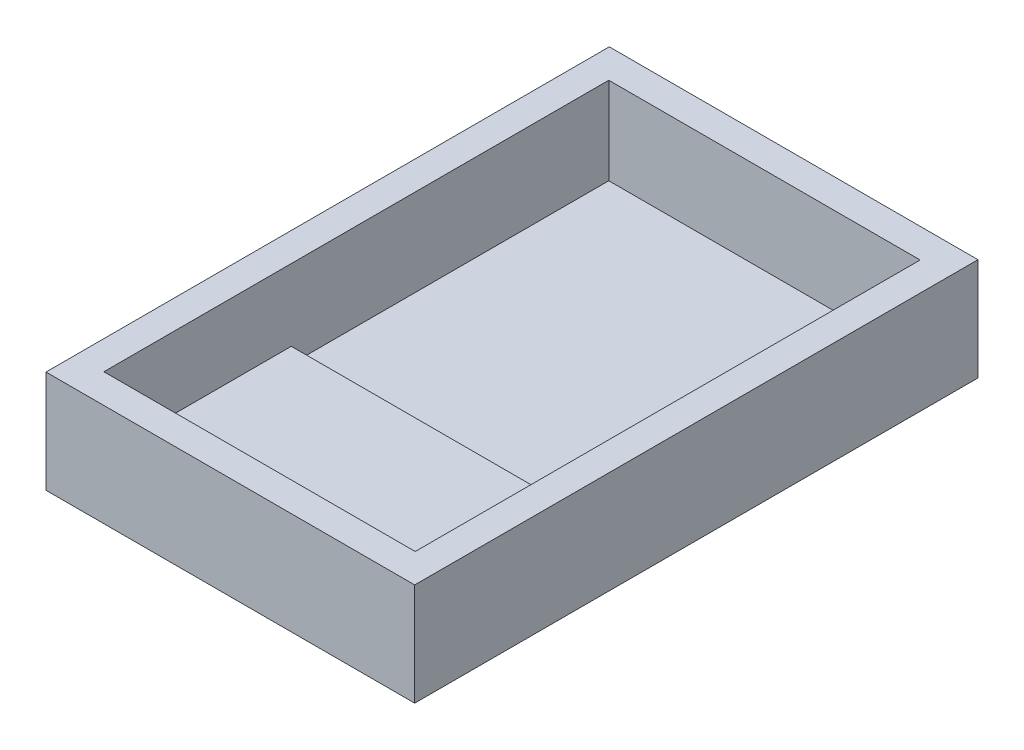
ISO-10303-21;
HEADER;
FILE_DESCRIPTION(('STEP AP214'),'2;1');
FILE_NAME('part.step','',(''),(''),'','','');
FILE_SCHEMA(('AUTOMOTIVE_DESIGN { 1 0 10303 214 1 1 1 1 }'));
ENDSEC;
DATA;
#1=APPLICATION_CONTEXT('core data for automotive mechanical design processes');
#2=APPLICATION_PROTOCOL_DEFINITION('international standard','automotive_design',2000,#1);
#3=PRODUCT_CONTEXT('',#1,'mechanical');
#4=PRODUCT('Part','Part','',(#3));
#5=PRODUCT_RELATED_PRODUCT_CATEGORY('part','',(#4));
#6=PRODUCT_DEFINITION_FORMATION('','',#4);
#7=PRODUCT_DEFINITION_CONTEXT('part definition',#1,'design');
#8=PRODUCT_DEFINITION('design','',#6,#7);
#9=PRODUCT_DEFINITION_SHAPE('','',#8);
#10=(LENGTH_UNIT() NAMED_UNIT(*) SI_UNIT(.MILLI.,.METRE.));
#11=(NAMED_UNIT(*) PLANE_ANGLE_UNIT() SI_UNIT($,.RADIAN.));
#12=(NAMED_UNIT(*) SI_UNIT($,.STERADIAN.) SOLID_ANGLE_UNIT());
#13=UNCERTAINTY_MEASURE_WITH_UNIT(LENGTH_MEASURE(1.E-05),#10,'distance_accuracy_value','');
#14=(GEOMETRIC_REPRESENTATION_CONTEXT(3) GLOBAL_UNCERTAINTY_ASSIGNED_CONTEXT((#13)) GLOBAL_UNIT_ASSIGNED_CONTEXT((#10,
#11,#12)) REPRESENTATION_CONTEXT('',''));
#15=CARTESIAN_POINT('',(0.,0.,0.));
#16=DIRECTION('',(0.,0.,1.));
#17=DIRECTION('',(1.,0.,0.));
#18=AXIS2_PLACEMENT_3D('',#15,#16,#17);
#19=CARTESIAN_POINT('',(0.,3.,0.));
#20=DIRECTION('',(0.,-1.,0.));
#21=DIRECTION('',(0.,0.,-1.));
#22=AXIS2_PLACEMENT_3D('',#19,#20,#21);
#23=PLANE('',#22);
#24=DIRECTION('',(1.,0.,0.));
#25=VECTOR('',#24,1.);
#26=CARTESIAN_POINT('',(2.8,3.,-21.15));
#27=LINE('',#26,#25);
#28=CARTESIAN_POINT('',(2.8,3.,-21.15));
#29=VERTEX_POINT('',#28);
#30=CARTESIAN_POINT('',(33.2,3.,-21.15));
#31=VERTEX_POINT('',#30);
#32=EDGE_CURVE('E146',#29,#31,#27,.T.);
#33=ORIENTED_EDGE('',*,*,#32,.F.);
#34=DIRECTION('',(0.,0.,1.));
#35=VECTOR('',#34,1.);
#36=CARTESIAN_POINT('',(2.8,3.,-52.15));
#37=LINE('',#36,#35);
#38=CARTESIAN_POINT('',(2.8,3.,-2.85));
#39=VERTEX_POINT('',#38);
#40=EDGE_CURVE('E129',#29,#39,#37,.T.);
#41=ORIENTED_EDGE('',*,*,#40,.T.);
#42=DIRECTION('',(1.,0.,0.));
#43=VECTOR('',#42,1.);
#44=CARTESIAN_POINT('',(2.8,3.,-2.85));
#45=LINE('',#44,#43);
#46=CARTESIAN_POINT('',(33.2,3.,-2.85));
#47=VERTEX_POINT('',#46);
#48=EDGE_CURVE('E174',#39,#47,#45,.T.);
#49=ORIENTED_EDGE('',*,*,#48,.T.);
#50=DIRECTION('',(0.,0.,-1.));
#51=VECTOR('',#50,1.);
#52=CARTESIAN_POINT('',(33.2,3.,-52.15));
#53=LINE('',#52,#51);
#54=EDGE_CURVE('E161',#47,#31,#53,.T.);
#55=ORIENTED_EDGE('',*,*,#54,.T.);
#56=EDGE_LOOP('',(#33,#41,#49,#55));
#57=FACE_BOUND('',#56,.T.);
#58=ADVANCED_FACE('F43',(#57),#23,.F.);
#59=CARTESIAN_POINT('',(0.,3.,0.));
#60=DIRECTION('',(1.,0.,0.));
#61=DIRECTION('',(0.,0.,-1.));
#62=AXIS2_PLACEMENT_3D('',#59,#60,#61);
#63=PLANE('',#62);
#64=DIRECTION('',(0.,0.,1.));
#65=VECTOR('',#64,1.);
#66=CARTESIAN_POINT('',(0.,0.,0.));
#67=LINE('',#66,#65);
#68=CARTESIAN_POINT('',(0.,0.,-55.));
#69=VERTEX_POINT('',#68);
#70=CARTESIAN_POINT('',(0.,0.,0.));
#71=VERTEX_POINT('',#70);
#72=EDGE_CURVE('E208',#69,#71,#67,.T.);
#73=ORIENTED_EDGE('',*,*,#72,.T.);
#74=DIRECTION('',(0.,-1.,0.));
#75=VECTOR('',#74,1.);
#76=CARTESIAN_POINT('',(0.,3.,0.));
#77=LINE('',#76,#75);
#78=CARTESIAN_POINT('',(0.,10.,0.));
#79=VERTEX_POINT('',#78);
#80=EDGE_CURVE('E11',#79,#71,#77,.T.);
#81=ORIENTED_EDGE('',*,*,#80,.F.);
#82=DIRECTION('',(0.,0.,1.));
#83=VECTOR('',#82,1.);
#84=CARTESIAN_POINT('',(0.,10.,-55.));
#85=LINE('',#84,#83);
#86=CARTESIAN_POINT('',(0.,10.,-55.));
#87=VERTEX_POINT('',#86);
#88=EDGE_CURVE('E196',#87,#79,#85,.T.);
#89=ORIENTED_EDGE('',*,*,#88,.F.);
#90=DIRECTION('',(0.,-1.,0.));
#91=VECTOR('',#90,1.);
#92=CARTESIAN_POINT('',(0.,3.,-55.));
#93=LINE('',#92,#91);
#94=EDGE_CURVE('E220',#87,#69,#93,.T.);
#95=ORIENTED_EDGE('',*,*,#94,.T.);
#96=EDGE_LOOP('',(#73,#81,#89,#95));
#97=FACE_BOUND('',#96,.T.);
#98=ADVANCED_FACE('F45',(#97),#63,.F.);
#99=CARTESIAN_POINT('',(0.,3.,0.));
#100=DIRECTION('',(0.,0.,-1.));
#101=DIRECTION('',(-1.,0.,0.));
#102=AXIS2_PLACEMENT_3D('',#99,#100,#101);
#103=PLANE('',#102);
#104=DIRECTION('',(1.,0.,0.));
#105=VECTOR('',#104,1.);
#106=CARTESIAN_POINT('',(0.,0.,0.));
#107=LINE('',#106,#105);
#108=CARTESIAN_POINT('',(36.,0.,0.));
#109=VERTEX_POINT('',#108);
#110=EDGE_CURVE('E212',#71,#109,#107,.T.);
#111=ORIENTED_EDGE('',*,*,#110,.T.);
#112=DIRECTION('',(0.,-1.,0.));
#113=VECTOR('',#112,1.);
#114=CARTESIAN_POINT('',(36.,3.,0.));
#115=LINE('',#114,#113);
#116=CARTESIAN_POINT('',(36.,10.,0.));
#117=VERTEX_POINT('',#116);
#118=EDGE_CURVE('E52',#117,#109,#115,.T.);
#119=ORIENTED_EDGE('',*,*,#118,.F.);
#120=DIRECTION('',(1.,0.,0.));
#121=VECTOR('',#120,1.);
#122=CARTESIAN_POINT('',(0.,10.,0.));
#123=LINE('',#122,#121);
#124=EDGE_CURVE('E200',#79,#117,#123,.T.);
#125=ORIENTED_EDGE('',*,*,#124,.F.);
#126=ORIENTED_EDGE('',*,*,#80,.T.);
#127=EDGE_LOOP('',(#111,#119,#125,#126));
#128=FACE_BOUND('',#127,.T.);
#129=ADVANCED_FACE('F243',(#128),#103,.F.);
#130=CARTESIAN_POINT('',(36.,3.,0.));
#131=DIRECTION('',(-1.,0.,0.));
#132=DIRECTION('',(0.,0.,1.));
#133=AXIS2_PLACEMENT_3D('',#130,#131,#132);
#134=PLANE('',#133);
#135=DIRECTION('',(0.,0.,-1.));
#136=VECTOR('',#135,1.);
#137=CARTESIAN_POINT('',(36.,0.,0.));
#138=LINE('',#137,#136);
#139=CARTESIAN_POINT('',(36.,0.,-55.));
#140=VERTEX_POINT('',#139);
#141=EDGE_CURVE('E215',#109,#140,#138,.T.);
#142=ORIENTED_EDGE('',*,*,#141,.T.);
#143=DIRECTION('',(0.,-1.,0.));
#144=VECTOR('',#143,1.);
#145=CARTESIAN_POINT('',(36.,3.,-55.));
#146=LINE('',#145,#144);
#147=CARTESIAN_POINT('',(36.,10.,-55.));
#148=VERTEX_POINT('',#147);
#149=EDGE_CURVE('E223',#148,#140,#146,.T.);
#150=ORIENTED_EDGE('',*,*,#149,.F.);
#151=DIRECTION('',(0.,0.,-1.));
#152=VECTOR('',#151,1.);
#153=CARTESIAN_POINT('',(36.,10.,0.));
#154=LINE('',#153,#152);
#155=EDGE_CURVE('E204',#117,#148,#154,.T.);
#156=ORIENTED_EDGE('',*,*,#155,.F.);
#157=ORIENTED_EDGE('',*,*,#118,.T.);
#158=EDGE_LOOP('',(#142,#150,#156,#157));
#159=FACE_BOUND('',#158,.T.);
#160=ADVANCED_FACE('F230',(#159),#134,.F.);
#161=CARTESIAN_POINT('',(0.,3.,-55.));
#162=DIRECTION('',(0.,0.,1.));
#163=DIRECTION('',(1.,0.,0.));
#164=AXIS2_PLACEMENT_3D('',#161,#162,#163);
#165=PLANE('',#164);
#166=DIRECTION('',(-1.,0.,0.));
#167=VECTOR('',#166,1.);
#168=CARTESIAN_POINT('',(0.,0.,-55.));
#169=LINE('',#168,#167);
#170=EDGE_CURVE('E67',#140,#69,#169,.T.);
#171=ORIENTED_EDGE('',*,*,#170,.T.);
#172=ORIENTED_EDGE('',*,*,#94,.F.);
#173=DIRECTION('',(-1.,0.,0.));
#174=VECTOR('',#173,1.);
#175=CARTESIAN_POINT('',(36.,10.,-55.));
#176=LINE('',#175,#174);
#177=EDGE_CURVE('E192',#148,#87,#176,.T.);
#178=ORIENTED_EDGE('',*,*,#177,.F.);
#179=ORIENTED_EDGE('',*,*,#149,.T.);
#180=EDGE_LOOP('',(#171,#172,#178,#179));
#181=FACE_BOUND('',#180,.T.);
#182=ADVANCED_FACE('F239',(#181),#165,.F.);
#183=CARTESIAN_POINT('',(0.,0.,0.));
#184=DIRECTION('',(0.,-1.,0.));
#185=DIRECTION('',(0.,0.,-1.));
#186=AXIS2_PLACEMENT_3D('',#183,#184,#185);
#187=PLANE('',#186);
#188=ORIENTED_EDGE('',*,*,#72,.F.);
#189=ORIENTED_EDGE('',*,*,#170,.F.);
#190=ORIENTED_EDGE('',*,*,#141,.F.);
#191=ORIENTED_EDGE('',*,*,#110,.F.);
#192=EDGE_LOOP('',(#188,#189,#190,#191));
#193=FACE_BOUND('',#192,.T.);
#194=ADVANCED_FACE('F235',(#193),#187,.T.);
#195=CARTESIAN_POINT('',(0.,10.,0.));
#196=DIRECTION('',(0.,1.,0.));
#197=DIRECTION('',(0.,0.,1.));
#198=AXIS2_PLACEMENT_3D('',#195,#196,#197);
#199=PLANE('',#198);
#200=ORIENTED_EDGE('',*,*,#177,.T.);
#201=ORIENTED_EDGE('',*,*,#88,.T.);
#202=ORIENTED_EDGE('',*,*,#124,.T.);
#203=ORIENTED_EDGE('',*,*,#155,.T.);
#204=EDGE_LOOP('',(#200,#201,#202,#203));
#205=FACE_BOUND('',#204,.T.);
#206=DIRECTION('',(1.,0.,0.));
#207=VECTOR('',#206,1.);
#208=CARTESIAN_POINT('',(2.8,10.,-2.85));
#209=LINE('',#208,#207);
#210=CARTESIAN_POINT('',(2.8,10.,-2.85));
#211=VERTEX_POINT('',#210);
#212=CARTESIAN_POINT('',(33.2,10.,-2.85));
#213=VERTEX_POINT('',#212);
#214=EDGE_CURVE('E160',#211,#213,#209,.T.);
#215=ORIENTED_EDGE('',*,*,#214,.F.);
#216=DIRECTION('',(0.,0.,1.));
#217=VECTOR('',#216,1.);
#218=CARTESIAN_POINT('',(2.8,10.,-52.15));
#219=LINE('',#218,#217);
#220=CARTESIAN_POINT('',(2.8,10.,-52.15));
#221=VERTEX_POINT('',#220);
#222=EDGE_CURVE('E157',#221,#211,#219,.T.);
#223=ORIENTED_EDGE('',*,*,#222,.F.);
#224=DIRECTION('',(-1.,0.,0.));
#225=VECTOR('',#224,1.);
#226=CARTESIAN_POINT('',(2.8,10.,-52.15));
#227=LINE('',#226,#225);
#228=CARTESIAN_POINT('',(33.2,10.,-52.15));
#229=VERTEX_POINT('',#228);
#230=EDGE_CURVE('E168',#229,#221,#227,.T.);
#231=ORIENTED_EDGE('',*,*,#230,.F.);
#232=DIRECTION('',(0.,0.,-1.));
#233=VECTOR('',#232,1.);
#234=CARTESIAN_POINT('',(33.2,10.,-52.15));
#235=LINE('',#234,#233);
#236=EDGE_CURVE('E164',#213,#229,#235,.T.);
#237=ORIENTED_EDGE('',*,*,#236,.F.);
#238=EDGE_LOOP('',(#215,#223,#231,#237));
#239=FACE_BOUND('',#238,.T.);
#240=ADVANCED_FACE('F241',(#205,#239),#199,.T.);
#241=CARTESIAN_POINT('',(2.8,10.,-52.15));
#242=DIRECTION('',(1.,0.,0.));
#243=DIRECTION('',(0.,0.,-1.));
#244=AXIS2_PLACEMENT_3D('',#241,#242,#243);
#245=PLANE('',#244);
#246=ORIENTED_EDGE('',*,*,#40,.F.);
#247=DIRECTION('',(0.,1.,0.));
#248=VECTOR('',#247,1.);
#249=CARTESIAN_POINT('',(2.8,1.5,-21.15));
#250=LINE('',#249,#248);
#251=CARTESIAN_POINT('',(2.8,1.5,-21.15));
#252=VERTEX_POINT('',#251);
#253=EDGE_CURVE('E59',#252,#29,#250,.T.);
#254=ORIENTED_EDGE('',*,*,#253,.F.);
#255=DIRECTION('',(0.,0.,1.));
#256=VECTOR('',#255,1.);
#257=CARTESIAN_POINT('',(2.8,1.5,-52.15));
#258=LINE('',#257,#256);
#259=CARTESIAN_POINT('',(2.8,1.5,-52.15));
#260=VERTEX_POINT('',#259);
#261=EDGE_CURVE('E126',#260,#252,#258,.T.);
#262=ORIENTED_EDGE('',*,*,#261,.F.);
#263=DIRECTION('',(0.,-1.,0.));
#264=VECTOR('',#263,1.);
#265=CARTESIAN_POINT('',(2.8,10.,-52.15));
#266=LINE('',#265,#264);
#267=EDGE_CURVE('E171',#221,#260,#266,.T.);
#268=ORIENTED_EDGE('',*,*,#267,.F.);
#269=ORIENTED_EDGE('',*,*,#222,.T.);
#270=DIRECTION('',(0.,-1.,0.));
#271=VECTOR('',#270,1.);
#272=CARTESIAN_POINT('',(2.8,10.,-2.85));
#273=LINE('',#272,#271);
#274=EDGE_CURVE('E189',#211,#39,#273,.T.);
#275=ORIENTED_EDGE('',*,*,#274,.T.);
#276=EDGE_LOOP('',(#246,#254,#262,#268,#269,#275));
#277=FACE_BOUND('',#276,.T.);
#278=ADVANCED_FACE('F123',(#277),#245,.T.);
#279=CARTESIAN_POINT('',(2.8,10.,-2.85));
#280=DIRECTION('',(0.,0.,-1.));
#281=DIRECTION('',(-1.,0.,0.));
#282=AXIS2_PLACEMENT_3D('',#279,#280,#281);
#283=PLANE('',#282);
#284=ORIENTED_EDGE('',*,*,#48,.F.);
#285=ORIENTED_EDGE('',*,*,#274,.F.);
#286=ORIENTED_EDGE('',*,*,#214,.T.);
#287=DIRECTION('',(0.,-1.,0.));
#288=VECTOR('',#287,1.);
#289=CARTESIAN_POINT('',(33.2,10.,-2.85));
#290=LINE('',#289,#288);
#291=EDGE_CURVE('E186',#213,#47,#290,.T.);
#292=ORIENTED_EDGE('',*,*,#291,.T.);
#293=EDGE_LOOP('',(#284,#285,#286,#292));
#294=FACE_BOUND('',#293,.T.);
#295=ADVANCED_FACE('F282',(#294),#283,.T.);
#296=CARTESIAN_POINT('',(33.2,10.,-52.15));
#297=DIRECTION('',(-1.,0.,0.));
#298=DIRECTION('',(0.,0.,1.));
#299=AXIS2_PLACEMENT_3D('',#296,#297,#298);
#300=PLANE('',#299);
#301=ORIENTED_EDGE('',*,*,#54,.F.);
#302=ORIENTED_EDGE('',*,*,#291,.F.);
#303=ORIENTED_EDGE('',*,*,#236,.T.);
#304=DIRECTION('',(0.,-1.,0.));
#305=VECTOR('',#304,1.);
#306=CARTESIAN_POINT('',(33.2,10.,-52.15));
#307=LINE('',#306,#305);
#308=CARTESIAN_POINT('',(33.2,1.5,-52.15));
#309=VERTEX_POINT('',#308);
#310=EDGE_CURVE('E183',#229,#309,#307,.T.);
#311=ORIENTED_EDGE('',*,*,#310,.T.);
#312=DIRECTION('',(0.,0.,-1.));
#313=VECTOR('',#312,1.);
#314=CARTESIAN_POINT('',(33.2,1.5,-52.15));
#315=LINE('',#314,#313);
#316=CARTESIAN_POINT('',(33.2,1.5,-21.15));
#317=VERTEX_POINT('',#316);
#318=EDGE_CURVE('E141',#317,#309,#315,.T.);
#319=ORIENTED_EDGE('',*,*,#318,.F.);
#320=DIRECTION('',(0.,1.,0.));
#321=VECTOR('',#320,1.);
#322=CARTESIAN_POINT('',(33.2,1.5,-21.15));
#323=LINE('',#322,#321);
#324=EDGE_CURVE('E131',#317,#31,#323,.T.);
#325=ORIENTED_EDGE('',*,*,#324,.T.);
#326=EDGE_LOOP('',(#301,#302,#303,#311,#319,#325));
#327=FACE_BOUND('',#326,.T.);
#328=ADVANCED_FACE('F288',(#327),#300,.T.);
#329=CARTESIAN_POINT('',(2.8,10.,-52.15));
#330=DIRECTION('',(0.,0.,1.));
#331=DIRECTION('',(1.,0.,0.));
#332=AXIS2_PLACEMENT_3D('',#329,#330,#331);
#333=PLANE('',#332);
#334=ORIENTED_EDGE('',*,*,#267,.T.);
#335=DIRECTION('',(-1.,0.,0.));
#336=VECTOR('',#335,1.);
#337=CARTESIAN_POINT('',(2.8,1.5,-52.15));
#338=LINE('',#337,#336);
#339=EDGE_CURVE('E132',#309,#260,#338,.T.);
#340=ORIENTED_EDGE('',*,*,#339,.F.);
#341=ORIENTED_EDGE('',*,*,#310,.F.);
#342=ORIENTED_EDGE('',*,*,#230,.T.);
#343=EDGE_LOOP('',(#334,#340,#341,#342));
#344=FACE_BOUND('',#343,.T.);
#345=ADVANCED_FACE('F295',(#344),#333,.T.);
#346=CARTESIAN_POINT('',(2.8,1.5,-21.15));
#347=DIRECTION('',(0.,0.,1.));
#348=DIRECTION('',(1.,0.,0.));
#349=AXIS2_PLACEMENT_3D('',#346,#347,#348);
#350=PLANE('',#349);
#351=ORIENTED_EDGE('',*,*,#32,.T.);
#352=ORIENTED_EDGE('',*,*,#324,.F.);
#353=DIRECTION('',(1.,0.,0.));
#354=VECTOR('',#353,1.);
#355=CARTESIAN_POINT('',(2.8,1.5,-21.15));
#356=LINE('',#355,#354);
#357=EDGE_CURVE('E135',#252,#317,#356,.T.);
#358=ORIENTED_EDGE('',*,*,#357,.F.);
#359=ORIENTED_EDGE('',*,*,#253,.T.);
#360=EDGE_LOOP('',(#351,#352,#358,#359));
#361=FACE_BOUND('',#360,.T.);
#362=ADVANCED_FACE('F136',(#361),#350,.F.);
#363=CARTESIAN_POINT('',(0.,1.5,0.));
#364=DIRECTION('',(0.,1.,0.));
#365=DIRECTION('',(0.,0.,1.));
#366=AXIS2_PLACEMENT_3D('',#363,#364,#365);
#367=PLANE('',#366);
#368=ORIENTED_EDGE('',*,*,#261,.T.);
#369=ORIENTED_EDGE('',*,*,#357,.T.);
#370=ORIENTED_EDGE('',*,*,#318,.T.);
#371=ORIENTED_EDGE('',*,*,#339,.T.);
#372=EDGE_LOOP('',(#368,#369,#370,#371));
#373=FACE_BOUND('',#372,.T.);
#374=ADVANCED_FACE('F143',(#373),#367,.T.);
#375=CLOSED_SHELL('',(#58,#98,#129,#160,#182,#194,#240,#278,#295,#328,#345,#362,#374));
#376=MANIFOLD_SOLID_BREP('B2',#375);
#377=ADVANCED_BREP_SHAPE_REPRESENTATION('',(#18,#376),#14);
#378=SHAPE_DEFINITION_REPRESENTATION(#9,#377);
ENDSEC;
END-ISO-10303-21;
